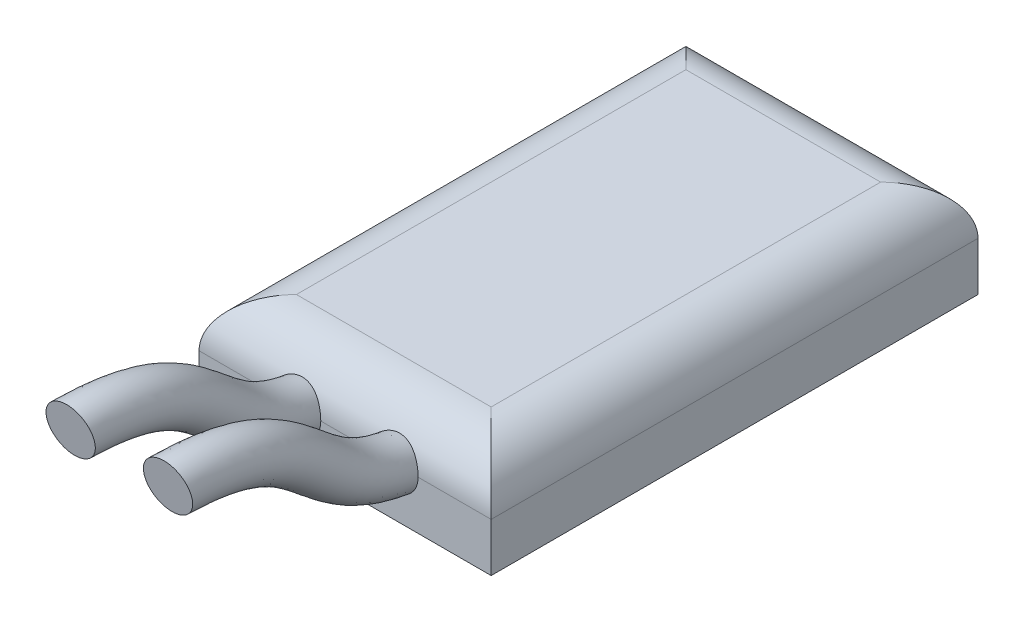
ISO-10303-21;
HEADER;
FILE_DESCRIPTION(('STEP AP214'),'2;1');
FILE_NAME('part.step','',(''),(''),'','','');
FILE_SCHEMA(('AUTOMOTIVE_DESIGN { 1 0 10303 214 1 1 1 1 }'));
ENDSEC;
DATA;
#1=APPLICATION_CONTEXT('core data for automotive mechanical design processes');
#2=APPLICATION_PROTOCOL_DEFINITION('international standard','automotive_design',2000,#1);
#3=PRODUCT_CONTEXT('',#1,'mechanical');
#4=PRODUCT('Part','Part','',(#3));
#5=PRODUCT_RELATED_PRODUCT_CATEGORY('part','',(#4));
#6=PRODUCT_DEFINITION_FORMATION('','',#4);
#7=PRODUCT_DEFINITION_CONTEXT('part definition',#1,'design');
#8=PRODUCT_DEFINITION('design','',#6,#7);
#9=PRODUCT_DEFINITION_SHAPE('','',#8);
#10=(LENGTH_UNIT() NAMED_UNIT(*) SI_UNIT(.MILLI.,.METRE.));
#11=(NAMED_UNIT(*) PLANE_ANGLE_UNIT() SI_UNIT($,.RADIAN.));
#12=(NAMED_UNIT(*) SI_UNIT($,.STERADIAN.) SOLID_ANGLE_UNIT());
#13=UNCERTAINTY_MEASURE_WITH_UNIT(LENGTH_MEASURE(1.E-05),#10,'distance_accuracy_value','');
#14=(GEOMETRIC_REPRESENTATION_CONTEXT(3) GLOBAL_UNCERTAINTY_ASSIGNED_CONTEXT((#13)) GLOBAL_UNIT_ASSIGNED_CONTEXT((#10,
#11,#12)) REPRESENTATION_CONTEXT('',''));
#15=CARTESIAN_POINT('',(0.,0.,0.));
#16=DIRECTION('',(0.,0.,1.));
#17=DIRECTION('',(1.,0.,0.));
#18=AXIS2_PLACEMENT_3D('',#15,#16,#17);
#19=CARTESIAN_POINT('',(0.,0.,5.));
#20=DIRECTION('',(1.,0.,0.));
#21=DIRECTION('',(0.,0.,-1.));
#22=AXIS2_PLACEMENT_3D('',#19,#20,#21);
#23=PLANE('',#22);
#24=DIRECTION('',(0.,-1.,0.));
#25=VECTOR('',#24,1.);
#26=CARTESIAN_POINT('',(0.,0.,5.));
#27=LINE('',#26,#25);
#28=CARTESIAN_POINT('',(0.,0.5,5.));
#29=VERTEX_POINT('',#28);
#30=CARTESIAN_POINT('',(0.,0.,5.));
#31=VERTEX_POINT('',#30);
#32=EDGE_CURVE('E97',#29,#31,#27,.T.);
#33=ORIENTED_EDGE('',*,*,#32,.F.);
#34=DIRECTION('',(0.,0.,-1.));
#35=VECTOR('',#34,1.);
#36=CARTESIAN_POINT('',(0.,0.5,5.));
#37=LINE('',#36,#35);
#38=CARTESIAN_POINT('',(0.,0.5,0.));
#39=VERTEX_POINT('',#38);
#40=EDGE_CURVE('E50',#29,#39,#37,.T.);
#41=ORIENTED_EDGE('',*,*,#40,.T.);
#42=DIRECTION('',(0.,-1.,0.));
#43=VECTOR('',#42,1.);
#44=CARTESIAN_POINT('',(0.,0.,0.));
#45=LINE('',#44,#43);
#46=CARTESIAN_POINT('',(0.,0.,0.));
#47=VERTEX_POINT('',#46);
#48=EDGE_CURVE('E115',#39,#47,#45,.T.);
#49=ORIENTED_EDGE('',*,*,#48,.T.);
#50=DIRECTION('',(0.,0.,-1.));
#51=VECTOR('',#50,1.);
#52=CARTESIAN_POINT('',(0.,0.,5.));
#53=LINE('',#52,#51);
#54=EDGE_CURVE('E109',#31,#47,#53,.T.);
#55=ORIENTED_EDGE('',*,*,#54,.F.);
#56=EDGE_LOOP('',(#33,#41,#49,#55));
#57=FACE_BOUND('',#56,.T.);
#58=ADVANCED_FACE('F33',(#57),#23,.F.);
#59=CARTESIAN_POINT('',(0.,0.,5.));
#60=DIRECTION('',(0.,1.,0.));
#61=DIRECTION('',(0.,0.,1.));
#62=AXIS2_PLACEMENT_3D('',#59,#60,#61);
#63=PLANE('',#62);
#64=DIRECTION('',(1.,0.,0.));
#65=VECTOR('',#64,1.);
#66=CARTESIAN_POINT('',(0.,0.,0.));
#67=LINE('',#66,#65);
#68=CARTESIAN_POINT('',(3.,0.,0.));
#69=VERTEX_POINT('',#68);
#70=EDGE_CURVE('E238',#47,#69,#67,.T.);
#71=ORIENTED_EDGE('',*,*,#70,.T.);
#72=DIRECTION('',(0.,0.,-1.));
#73=VECTOR('',#72,1.);
#74=CARTESIAN_POINT('',(3.,0.,5.));
#75=LINE('',#74,#73);
#76=CARTESIAN_POINT('',(3.,0.,5.));
#77=VERTEX_POINT('',#76);
#78=EDGE_CURVE('E111',#77,#69,#75,.T.);
#79=ORIENTED_EDGE('',*,*,#78,.F.);
#80=DIRECTION('',(1.,0.,0.));
#81=VECTOR('',#80,1.);
#82=CARTESIAN_POINT('',(0.,0.,5.));
#83=LINE('',#82,#81);
#84=EDGE_CURVE('E101',#31,#77,#83,.T.);
#85=ORIENTED_EDGE('',*,*,#84,.F.);
#86=ORIENTED_EDGE('',*,*,#54,.T.);
#87=EDGE_LOOP('',(#71,#79,#85,#86));
#88=FACE_BOUND('',#87,.T.);
#89=ADVANCED_FACE('F108',(#88),#63,.F.);
#90=CARTESIAN_POINT('',(3.,0.,5.));
#91=DIRECTION('',(-1.,0.,0.));
#92=DIRECTION('',(0.,0.,1.));
#93=AXIS2_PLACEMENT_3D('',#90,#91,#92);
#94=PLANE('',#93);
#95=DIRECTION('',(0.,1.,0.));
#96=VECTOR('',#95,1.);
#97=CARTESIAN_POINT('',(3.,0.,0.));
#98=LINE('',#97,#96);
#99=CARTESIAN_POINT('',(3.,0.5,0.));
#100=VERTEX_POINT('',#99);
#101=EDGE_CURVE('E104',#69,#100,#98,.T.);
#102=ORIENTED_EDGE('',*,*,#101,.T.);
#103=DIRECTION('',(0.,0.,-1.));
#104=VECTOR('',#103,1.);
#105=CARTESIAN_POINT('',(3.,0.5,5.));
#106=LINE('',#105,#104);
#107=CARTESIAN_POINT('',(3.,0.5,5.));
#108=VERTEX_POINT('',#107);
#109=EDGE_CURVE('E130',#100,#108,#106,.F.);
#110=ORIENTED_EDGE('',*,*,#109,.T.);
#111=DIRECTION('',(0.,1.,0.));
#112=VECTOR('',#111,1.);
#113=CARTESIAN_POINT('',(3.,0.,5.));
#114=LINE('',#113,#112);
#115=EDGE_CURVE('E113',#77,#108,#114,.T.);
#116=ORIENTED_EDGE('',*,*,#115,.F.);
#117=ORIENTED_EDGE('',*,*,#78,.T.);
#118=EDGE_LOOP('',(#102,#110,#116,#117));
#119=FACE_BOUND('',#118,.T.);
#120=ADVANCED_FACE('F195',(#119),#94,.F.);
#121=CARTESIAN_POINT('',(0.,1.,5.));
#122=DIRECTION('',(0.,-1.,0.));
#123=DIRECTION('',(0.,0.,-1.));
#124=AXIS2_PLACEMENT_3D('',#121,#122,#123);
#125=PLANE('',#124);
#126=DIRECTION('',(-1.,0.,0.));
#127=VECTOR('',#126,1.);
#128=CARTESIAN_POINT('',(0.,1.,4.5));
#129=LINE('',#128,#127);
#130=CARTESIAN_POINT('',(0.5,1.,4.5));
#131=VERTEX_POINT('',#130);
#132=CARTESIAN_POINT('',(2.5,1.,4.5));
#133=VERTEX_POINT('',#132);
#134=EDGE_CURVE('E125',#131,#133,#129,.F.);
#135=ORIENTED_EDGE('',*,*,#134,.T.);
#136=DIRECTION('',(0.,0.,-1.));
#137=VECTOR('',#136,1.);
#138=CARTESIAN_POINT('',(2.5,1.,5.));
#139=LINE('',#138,#137);
#140=CARTESIAN_POINT('',(2.5,1.,0.5));
#141=VERTEX_POINT('',#140);
#142=EDGE_CURVE('E127',#133,#141,#139,.T.);
#143=ORIENTED_EDGE('',*,*,#142,.T.);
#144=DIRECTION('',(-1.,0.,0.));
#145=VECTOR('',#144,1.);
#146=CARTESIAN_POINT('',(0.,1.,0.5));
#147=LINE('',#146,#145);
#148=CARTESIAN_POINT('',(0.5,1.,0.5));
#149=VERTEX_POINT('',#148);
#150=EDGE_CURVE('E117',#141,#149,#147,.T.);
#151=ORIENTED_EDGE('',*,*,#150,.T.);
#152=DIRECTION('',(0.,0.,-1.));
#153=VECTOR('',#152,1.);
#154=CARTESIAN_POINT('',(0.5,1.,5.));
#155=LINE('',#154,#153);
#156=EDGE_CURVE('E119',#149,#131,#155,.F.);
#157=ORIENTED_EDGE('',*,*,#156,.T.);
#158=EDGE_LOOP('',(#135,#143,#151,#157));
#159=FACE_BOUND('',#158,.T.);
#160=ADVANCED_FACE('F189',(#159),#125,.F.);
#161=CARTESIAN_POINT('',(0.,0.,5.));
#162=DIRECTION('',(0.,0.,-1.));
#163=DIRECTION('',(-1.,0.,0.));
#164=AXIS2_PLACEMENT_3D('',#161,#162,#163);
#165=PLANE('',#164);
#166=ORIENTED_EDGE('',*,*,#115,.T.);
#167=DIRECTION('',(-1.,0.,0.));
#168=VECTOR('',#167,1.);
#169=CARTESIAN_POINT('',(0.,0.5,5.));
#170=LINE('',#169,#168);
#171=CARTESIAN_POINT('',(2.25,0.5,5.));
#172=VERTEX_POINT('',#171);
#173=EDGE_CURVE('E136',#108,#172,#170,.T.);
#174=ORIENTED_EDGE('',*,*,#173,.T.);
#175=CARTESIAN_POINT('',(2.,0.5,5.));
#176=DIRECTION('',(0.,0.,1.));
#177=DIRECTION('',(1.,0.,0.));
#178=AXIS2_PLACEMENT_3D('',#175,#176,#177);
#179=CIRCLE('',#178,0.25);
#180=CARTESIAN_POINT('',(1.75,0.5,5.));
#181=VERTEX_POINT('',#180);
#182=EDGE_CURVE('E224',#181,#172,#179,.T.);
#183=ORIENTED_EDGE('',*,*,#182,.F.);
#184=DIRECTION('',(-1.,0.,0.));
#185=VECTOR('',#184,1.);
#186=CARTESIAN_POINT('',(0.,0.5,5.));
#187=LINE('',#186,#185);
#188=CARTESIAN_POINT('',(1.25,0.5,5.));
#189=VERTEX_POINT('',#188);
#190=EDGE_CURVE('E134',#181,#189,#187,.T.);
#191=ORIENTED_EDGE('',*,*,#190,.T.);
#192=CARTESIAN_POINT('',(1.,0.5,5.));
#193=DIRECTION('',(0.,0.,1.));
#194=DIRECTION('',(1.,0.,0.));
#195=AXIS2_PLACEMENT_3D('',#192,#193,#194);
#196=CIRCLE('',#195,0.25);
#197=CARTESIAN_POINT('',(0.75,0.5,5.));
#198=VERTEX_POINT('',#197);
#199=EDGE_CURVE('E241',#198,#189,#196,.T.);
#200=ORIENTED_EDGE('',*,*,#199,.F.);
#201=DIRECTION('',(-1.,0.,0.));
#202=VECTOR('',#201,1.);
#203=CARTESIAN_POINT('',(0.,0.5,5.));
#204=LINE('',#203,#202);
#205=EDGE_CURVE('E58',#198,#29,#204,.T.);
#206=ORIENTED_EDGE('',*,*,#205,.T.);
#207=ORIENTED_EDGE('',*,*,#32,.T.);
#208=ORIENTED_EDGE('',*,*,#84,.T.);
#209=EDGE_LOOP('',(#166,#174,#183,#191,#200,#206,#207,#208));
#210=FACE_BOUND('',#209,.T.);
#211=ADVANCED_FACE('F100',(#210),#165,.F.);
#212=CARTESIAN_POINT('',(0.,0.,0.));
#213=DIRECTION('',(0.,0.,-1.));
#214=DIRECTION('',(-1.,0.,0.));
#215=AXIS2_PLACEMENT_3D('',#212,#213,#214);
#216=PLANE('',#215);
#217=ORIENTED_EDGE('',*,*,#48,.F.);
#218=DIRECTION('',(-1.,0.,0.));
#219=VECTOR('',#218,1.);
#220=CARTESIAN_POINT('',(3.,0.5,0.));
#221=LINE('',#220,#219);
#222=EDGE_CURVE('E139',#39,#100,#221,.F.);
#223=ORIENTED_EDGE('',*,*,#222,.T.);
#224=ORIENTED_EDGE('',*,*,#101,.F.);
#225=ORIENTED_EDGE('',*,*,#70,.F.);
#226=EDGE_LOOP('',(#217,#223,#224,#225));
#227=FACE_BOUND('',#226,.T.);
#228=ADVANCED_FACE('F178',(#227),#216,.T.);
#229=CARTESIAN_POINT('',(1.,1.45475411675825,7.31871146241119));
#230=DIRECTION('',(0.,-0.164550430209248,0.986368671399265));
#231=DIRECTION('',(1.,0.,0.));
#232=AXIS2_PLACEMENT_3D('',#229,#230,#231);
#233=PLANE('',#232);
#234=CARTESIAN_POINT('',(1.,1.45475411675825,7.31871146241119));
#235=DIRECTION('',(0.,-0.164550430209248,0.986368671399265));
#236=DIRECTION('',(1.,0.,0.));
#237=AXIS2_PLACEMENT_3D('',#234,#235,#236);
#238=CIRCLE('',#237,0.25);
#239=CARTESIAN_POINT('',(1.25,1.45475411675825,7.31871146241119));
#240=VERTEX_POINT('',#239);
#241=EDGE_CURVE('E239',#240,#240,#238,.T.);
#242=ORIENTED_EDGE('',*,*,#241,.T.);
#243=EDGE_LOOP('',(#242));
#244=FACE_BOUND('',#243,.T.);
#245=ADVANCED_FACE('F163',(#244),#233,.T.);
#246=CARTESIAN_POINT('',(1.25,0.484125174758523,4.91276463227716));
#247=CARTESIAN_POINT('',(1.25,0.489416783172348,4.94184308818477));
#248=CARTESIAN_POINT('',(1.25,0.494708391586174,4.97092154409239));
#249=CARTESIAN_POINT('',(1.25,0.5,5.));
#250=CARTESIAN_POINT('',(1.25,0.544324867641731,5.24357409100102));
#251=CARTESIAN_POINT('',(1.25,0.624832357919834,5.42004031458958));
#252=CARTESIAN_POINT('',(1.25,0.817152865986225,5.72053832479848));
#253=CARTESIAN_POINT('',(1.25,0.928965979331224,5.84456992130128));
#254=CARTESIAN_POINT('',(1.25,1.14283791089854,6.12198018721746));
#255=CARTESIAN_POINT('',(1.25,1.2448968674697,6.27535858085717));
#256=CARTESIAN_POINT('',(1.25,1.39820080077118,6.69324367563508));
#257=CARTESIAN_POINT('',(1.25,1.44944585215809,6.9577502283356));
#258=CARTESIAN_POINT('',(1.25,1.45475411675825,7.31871146241119));
#259=CARTESIAN_POINT('',(1.25,0.984125168621809,4.935723922914));
#260=CARTESIAN_POINT('',(1.25,0.989416779081206,4.95714928194267));
#261=CARTESIAN_POINT('',(1.25,0.994708389540603,4.97857464097133));
#262=CARTESIAN_POINT('',(1.25,1.,5.));
#263=CARTESIAN_POINT('',(1.25,1.04432488477634,5.17946834475525));
#264=CARTESIAN_POINT('',(1.25,1.10679147464032,5.2774891327332));
#265=CARTESIAN_POINT('',(1.25,1.2603646857412,5.48353880081818));
#266=CARTESIAN_POINT('',(1.25,1.36200744077146,5.59343133675019));
#267=CARTESIAN_POINT('',(1.25,1.59827658361381,5.91420369115885));
#268=CARTESIAN_POINT('',(1.25,1.72655789329307,6.12653559257453));
#269=CARTESIAN_POINT('',(1.25,1.90185167484027,6.67130232358191));
#270=CARTESIAN_POINT('',(1.25,1.9498245403609,6.99690019670553));
#271=CARTESIAN_POINT('',(1.25,1.94793845245788,7.40098667751581));
#272=CARTESIAN_POINT('',(0.75,0.984125168621809,4.935723922914));
#273=CARTESIAN_POINT('',(0.75,0.989416779081206,4.95714928194267));
#274=CARTESIAN_POINT('',(0.75,0.994708389540603,4.97857464097133));
#275=CARTESIAN_POINT('',(0.75,1.,5.));
#276=CARTESIAN_POINT('',(0.75,1.04432488477634,5.17946834475525));
#277=CARTESIAN_POINT('',(0.75,1.10679147464032,5.2774891327332));
#278=CARTESIAN_POINT('',(0.75,1.2603646857412,5.48353880081818));
#279=CARTESIAN_POINT('',(0.75,1.36200744077146,5.59343133675019));
#280=CARTESIAN_POINT('',(0.75,1.59827658361381,5.91420369115885));
#281=CARTESIAN_POINT('',(0.75,1.72655789329307,6.12653559257453));
#282=CARTESIAN_POINT('',(0.75,1.90185167484027,6.67130232358191));
#283=CARTESIAN_POINT('',(0.75,1.9498245403609,6.99690019670553));
#284=CARTESIAN_POINT('',(0.75,1.94793845245788,7.40098667751581));
#285=CARTESIAN_POINT('',(0.75,0.484125174758523,4.91276463227716));
#286=CARTESIAN_POINT('',(0.75,0.489416783172348,4.94184308818477));
#287=CARTESIAN_POINT('',(0.75,0.494708391586174,4.97092154409239));
#288=CARTESIAN_POINT('',(0.75,0.5,5.));
#289=CARTESIAN_POINT('',(0.75,0.544324867641731,5.24357409100102));
#290=CARTESIAN_POINT('',(0.75,0.624832357919834,5.42004031458958));
#291=CARTESIAN_POINT('',(0.75,0.817152865986225,5.72053832479848));
#292=CARTESIAN_POINT('',(0.75,0.928965979331224,5.84456992130128));
#293=CARTESIAN_POINT('',(0.75,1.14283791089854,6.12198018721746));
#294=CARTESIAN_POINT('',(0.75,1.2448968674697,6.27535858085717));
#295=CARTESIAN_POINT('',(0.75,1.39820080077118,6.69324367563508));
#296=CARTESIAN_POINT('',(0.75,1.44944585215809,6.9577502283356));
#297=CARTESIAN_POINT('',(0.75,1.45475411675825,7.31871146241119));
#298=CARTESIAN_POINT('',(0.75,-0.0158748191047642,4.88980534164031));
#299=CARTESIAN_POINT('',(0.75,-0.0105832127365094,4.92653689442688));
#300=CARTESIAN_POINT('',(0.75,-0.00529160636825458,4.96326844721344));
#301=CARTESIAN_POINT('',(0.75,0.,5.));
#302=CARTESIAN_POINT('',(0.75,0.0443248505071182,5.30767983724679));
#303=CARTESIAN_POINT('',(0.75,0.142873241199346,5.56259149644595));
#304=CARTESIAN_POINT('',(0.75,0.373941046231253,5.95753784877878));
#305=CARTESIAN_POINT('',(0.75,0.495924517890983,6.09570850585235));
#306=CARTESIAN_POINT('',(0.75,0.687399238183271,6.32975668327608));
#307=CARTESIAN_POINT('',(0.75,0.763235841646333,6.42418156913982));
#308=CARTESIAN_POINT('',(0.75,0.894549926702098,6.71518502768825));
#309=CARTESIAN_POINT('',(0.75,0.949067163955284,6.91860025996567));
#310=CARTESIAN_POINT('',(0.75,0.96156978105862,7.23643624730656));
#311=CARTESIAN_POINT('',(1.25,-0.0158748191047642,4.88980534164031));
#312=CARTESIAN_POINT('',(1.25,-0.0105832127365094,4.92653689442688));
#313=CARTESIAN_POINT('',(1.25,-0.00529160636825458,4.96326844721344));
#314=CARTESIAN_POINT('',(1.25,0.,5.));
#315=CARTESIAN_POINT('',(1.25,0.0443248505071182,5.30767983724679));
#316=CARTESIAN_POINT('',(1.25,0.142873241199346,5.56259149644595));
#317=CARTESIAN_POINT('',(1.25,0.373941046231253,5.95753784877878));
#318=CARTESIAN_POINT('',(1.25,0.495924517890983,6.09570850585235));
#319=CARTESIAN_POINT('',(1.25,0.687399238183271,6.32975668327608));
#320=CARTESIAN_POINT('',(1.25,0.763235841646333,6.42418156913982));
#321=CARTESIAN_POINT('',(1.25,0.894549926702098,6.71518502768825));
#322=CARTESIAN_POINT('',(1.25,0.949067163955284,6.91860025996567));
#323=CARTESIAN_POINT('',(1.25,0.96156978105862,7.23643624730656));
#324=CARTESIAN_POINT('',(1.25,0.484125174758523,4.91276463227716));
#325=CARTESIAN_POINT('',(1.25,0.489416783172348,4.94184308818477));
#326=CARTESIAN_POINT('',(1.25,0.494708391586174,4.97092154409239));
#327=CARTESIAN_POINT('',(1.25,0.5,5.));
#328=CARTESIAN_POINT('',(1.25,0.544324867641731,5.24357409100102));
#329=CARTESIAN_POINT('',(1.25,0.624832357919834,5.42004031458958));
#330=CARTESIAN_POINT('',(1.25,0.817152865986225,5.72053832479848));
#331=CARTESIAN_POINT('',(1.25,0.928965979331224,5.84456992130128));
#332=CARTESIAN_POINT('',(1.25,1.14283791089854,6.12198018721746));
#333=CARTESIAN_POINT('',(1.25,1.2448968674697,6.27535858085717));
#334=CARTESIAN_POINT('',(1.25,1.39820080077118,6.69324367563508));
#335=CARTESIAN_POINT('',(1.25,1.44944585215809,6.9577502283356));
#336=CARTESIAN_POINT('',(1.25,1.45475411675825,7.31871146241119));
#337=(BOUNDED_SURFACE() B_SPLINE_SURFACE(3,3,((#246,#247,#248,#249,#250,#251,#252,#253,#254,
#255,#256,#257,#258),(#259,#260,#261,#262,#263,#264,#265,#266,#267,#268,#269,#270,#271),(#272,
#273,#274,#275,#276,#277,#278,#279,#280,#281,#282,#283,#284),(#285,#286,#287,#288,#289,#290,
#291,#292,#293,#294,#295,#296,#297),(#298,#299,#300,#301,#302,#303,#304,#305,#306,#307,#308,
#309,#310),(#311,#312,#313,#314,#315,#316,#317,#318,#319,#320,#321,#322,#323),(#324,#325,#326,
#327,#328,#329,#330,#331,#332,#333,#334,#335,#336)),.UNSPECIFIED.,.T.,.F.,
.F.) B_SPLINE_SURFACE_WITH_KNOTS((4,3,4),(4,3,2,2,2,4),(0.,0.5,1.),(-0.0298455962496988,0.,0.25,
0.5,0.75,1.),.UNSPECIFIED.) GEOMETRIC_REPRESENTATION_ITEM() RATIONAL_B_SPLINE_SURFACE(((1.,1.,
1.,1.,1.,1.,1.,1.,1.,1.,1.,1.,1.),(0.333333333333333,0.333333333333333,0.333333333333333,
0.333333333333333,0.333333333333333,0.333333333333333,0.333333333333333,0.333333333333333,
0.333333333333333,0.333333333333333,0.333333333333333,0.333333333333333,0.333333333333333),
(0.333333333333333,0.333333333333333,0.333333333333333,0.333333333333333,0.333333333333333,
0.333333333333333,0.333333333333333,0.333333333333333,0.333333333333333,0.333333333333333,
0.333333333333333,0.333333333333333,0.333333333333333),(1.,1.,1.,1.,1.,1.,1.,1.,1.,1.,1.,1.,1.),
(0.333333333333333,0.333333333333333,0.333333333333333,0.333333333333333,0.333333333333333,
0.333333333333333,0.333333333333333,0.333333333333333,0.333333333333333,0.333333333333333,
0.333333333333333,0.333333333333333,0.333333333333333),(0.333333333333333,0.333333333333333,
0.333333333333333,0.333333333333333,0.333333333333333,0.333333333333333,0.333333333333333,
0.333333333333333,0.333333333333333,0.333333333333333,0.333333333333333,0.333333333333333,
0.333333333333333),(1.,1.,1.,1.,1.,1.,1.,1.,1.,1.,1.,1.,1.))) REPRESENTATION_ITEM('') SURFACE());
#338=CARTESIAN_POINT('',(1.25,0.5,5.));
#339=CARTESIAN_POINT('',(1.25001577630331,0.512513802455175,5.00001619365283));
#340=CARTESIAN_POINT('',(1.24906134716007,0.525024510689209,4.99953076061347));
#341=CARTESIAN_POINT('',(1.24525245425931,0.549649437979137,4.99767725604978));
#342=CARTESIAN_POINT('',(1.24240348425047,0.561764697492437,4.99631173693172));
#343=CARTESIAN_POINT('',(1.23484355214938,0.585291017112419,4.99281647419435));
#344=CARTESIAN_POINT('',(1.2301316018971,0.596701699778477,4.9906863250561));
#345=CARTESIAN_POINT('',(1.21899265086083,0.618516055103149,4.98587976062008));
#346=CARTESIAN_POINT('',(1.21256518625015,0.628919454382556,4.98320319763352));
#347=CARTESIAN_POINT('',(1.19067462552337,0.658672120474904,4.97460662912489));
#348=CARTESIAN_POINT('',(1.17274823478544,0.676126184410754,4.96819864933513));
#349=CARTESIAN_POINT('',(1.13065578805668,0.705889026988834,4.95595895019218));
#350=CARTESIAN_POINT('',(1.10611923128226,0.717706328405786,4.95020796376071));
#351=CARTESIAN_POINT('',(1.06675675880159,0.729700653902038,4.944135285532));
#352=CARTESIAN_POINT('',(1.05293092191441,0.732742470860885,4.94253261415151));
#353=CARTESIAN_POINT('',(1.02488233049136,0.736686759639859,4.94043748632099));
#354=CARTESIAN_POINT('',(1.01065962253997,0.737589481485852,4.93994490012017));
#355=CARTESIAN_POINT('',(0.98250050746977,0.737234701181964,4.94013578012992));
#356=CARTESIAN_POINT('',(0.968563418383754,0.736014448187997,4.94079896778553));
#357=CARTESIAN_POINT('',(0.941101977934181,0.73150612262758,4.94318322586574));
#358=CARTESIAN_POINT('',(0.927578207566431,0.728215268066099,4.94490571946999));
#359=CARTESIAN_POINT('',(0.901336861774428,0.719616945024645,4.94921189526239));
#360=CARTESIAN_POINT('',(0.888619165251762,0.714309780301696,4.95179544772487));
#361=CARTESIAN_POINT('',(0.864321425112865,0.701756843467227,4.95753868589132));
#362=CARTESIAN_POINT('',(0.852741389763131,0.69451105727068,4.96069837578116));
#363=CARTESIAN_POINT('',(0.830831329560909,0.678038112455434,4.96731408929893));
#364=CARTESIAN_POINT('',(0.820527610322683,0.668777581572601,4.97077442904957));
#365=CARTESIAN_POINT('',(0.801751491258326,0.648538312255451,4.97754546770545));
#366=CARTESIAN_POINT('',(0.793275427009547,0.637563089451016,4.9808564553114));
#367=CARTESIAN_POINT('',(0.778709019055091,0.614590315240592,4.98683093453614));
#368=CARTESIAN_POINT('',(0.772539421861002,0.602648355844245,4.98951443953976));
#369=CARTESIAN_POINT('',(0.762358908107379,0.577737292166054,4.99408152467847));
#370=CARTESIAN_POINT('',(0.758345930328228,0.564769182294179,4.99596586825887));
#371=CARTESIAN_POINT('',(0.753641060044594,0.543082071534407,4.99821285406736));
#372=CARTESIAN_POINT('',(0.752272014396903,0.534534378857633,4.99887972070089));
#373=CARTESIAN_POINT('',(0.750450666228952,0.517325570863692,4.99977464631043));
#374=CARTESIAN_POINT('',(0.749997677584225,0.50866454533011,5.00000303369982));
#375=CARTESIAN_POINT('',(0.75,0.5,5.));
#376=B_SPLINE_CURVE_WITH_KNOTS('',3,(#338,#339,#340,#341,#342,#343,#344,#345,#346,#347,#348,
#349,#350,#351,#352,#353,#354,#355,#356,#357,#358,#359,#360,#361,#362,#363,#364,#365,#366,#367,
#368,#369,#370,#371,#372,#373,#374,#375),.UNSPECIFIED.,.F.,.F.,(4,2,2,2,2,2,2,2,2,2,2,2,2,2,2,2,
2,2,4),(0.,0.037489072782986,0.0748699068652264,0.11227059510757,0.149681405702197,
0.225841492207322,0.30778604220665,0.350350118574107,0.392909219639123,0.434729100474368,
0.476605289517957,0.518475172415747,0.560345359526842,0.60297055340373,0.645509472884812,
0.686411456499948,0.727274277623486,0.753264911663422,0.779236071560857),.UNSPECIFIED.);
#377=EDGE_CURVE('E11',#189,#198,#376,.T.);
#378=ORIENTED_EDGE('',*,*,#241,.F.);
#379=EDGE_LOOP('',(#378));
#380=FACE_BOUND('',#379,.T.);
#381=ORIENTED_EDGE('',*,*,#199,.T.);
#382=ORIENTED_EDGE('',*,*,#377,.T.);
#383=EDGE_LOOP('',(#381,#382));
#384=FACE_BOUND('',#383,.T.);
#385=ADVANCED_FACE('F170',(#380,#384),#337,.T.);
#386=CARTESIAN_POINT('',(2.,1.45475411675825,7.31871146241119));
#387=DIRECTION('',(0.,-0.164550430209248,0.986368671399265));
#388=DIRECTION('',(1.,0.,0.));
#389=AXIS2_PLACEMENT_3D('',#386,#387,#388);
#390=PLANE('',#389);
#391=CARTESIAN_POINT('',(2.,1.45475411675825,7.31871146241119));
#392=DIRECTION('',(0.,-0.164550430209248,0.986368671399265));
#393=DIRECTION('',(1.,0.,0.));
#394=AXIS2_PLACEMENT_3D('',#391,#392,#393);
#395=CIRCLE('',#394,0.25);
#396=CARTESIAN_POINT('',(2.25,1.45475411675825,7.31871146241119));
#397=VERTEX_POINT('',#396);
#398=EDGE_CURVE('E245',#397,#397,#395,.T.);
#399=ORIENTED_EDGE('',*,*,#398,.T.);
#400=EDGE_LOOP('',(#399));
#401=FACE_BOUND('',#400,.T.);
#402=ADVANCED_FACE('F161',(#401),#390,.T.);
#403=CARTESIAN_POINT('',(2.25,0.484125174758529,4.91276463227719));
#404=CARTESIAN_POINT('',(2.25,0.489416783172353,4.9418430881848));
#405=CARTESIAN_POINT('',(2.25,0.494708391586176,4.9709215440924));
#406=CARTESIAN_POINT('',(2.25,0.5,5.));
#407=CARTESIAN_POINT('',(2.25,0.544324867641731,5.24357409100102));
#408=CARTESIAN_POINT('',(2.25,0.624832357919834,5.42004031458958));
#409=CARTESIAN_POINT('',(2.25,0.817152865986225,5.72053832479848));
#410=CARTESIAN_POINT('',(2.25,0.928965979331224,5.84456992130128));
#411=CARTESIAN_POINT('',(2.25,1.14283791089854,6.12198018721746));
#412=CARTESIAN_POINT('',(2.25,1.2448968674697,6.27535858085717));
#413=CARTESIAN_POINT('',(2.25,1.39820080077118,6.69324367563508));
#414=CARTESIAN_POINT('',(2.25,1.44944585215809,6.9577502283356));
#415=CARTESIAN_POINT('',(2.25,1.45475411675825,7.31871146241119));
#416=CARTESIAN_POINT('',(2.25,0.984125168621817,4.93572392291403));
#417=CARTESIAN_POINT('',(2.25,0.989416779081212,4.95714928194268));
#418=CARTESIAN_POINT('',(2.25,0.994708389540606,4.97857464097134));
#419=CARTESIAN_POINT('',(2.25,1.,5.));
#420=CARTESIAN_POINT('',(2.25,1.04432488477635,5.17946834475525));
#421=CARTESIAN_POINT('',(2.25,1.10679147464032,5.27748913273316));
#422=CARTESIAN_POINT('',(2.25,1.2603646857412,5.48353880081822));
#423=CARTESIAN_POINT('',(2.25,1.36200744077147,5.59343133675019));
#424=CARTESIAN_POINT('',(2.25,1.59827658361381,5.91420369115885));
#425=CARTESIAN_POINT('',(2.25,1.72655789329307,6.12653559257453));
#426=CARTESIAN_POINT('',(2.25,1.90185167484027,6.67130232358191));
#427=CARTESIAN_POINT('',(2.25,1.9498245403609,6.99690019670584));
#428=CARTESIAN_POINT('',(2.25,1.94793845245789,7.40098667751581));
#429=CARTESIAN_POINT('',(1.75,0.984125168621817,4.93572392291403));
#430=CARTESIAN_POINT('',(1.75,0.989416779081212,4.95714928194268));
#431=CARTESIAN_POINT('',(1.75,0.994708389540606,4.97857464097134));
#432=CARTESIAN_POINT('',(1.75,1.,5.));
#433=CARTESIAN_POINT('',(1.75,1.04432488477635,5.17946834475525));
#434=CARTESIAN_POINT('',(1.75,1.10679147464032,5.27748913273316));
#435=CARTESIAN_POINT('',(1.75,1.2603646857412,5.48353880081822));
#436=CARTESIAN_POINT('',(1.75,1.36200744077147,5.59343133675019));
#437=CARTESIAN_POINT('',(1.75,1.59827658361381,5.91420369115885));
#438=CARTESIAN_POINT('',(1.75,1.72655789329307,6.12653559257453));
#439=CARTESIAN_POINT('',(1.75,1.90185167484027,6.67130232358191));
#440=CARTESIAN_POINT('',(1.75,1.9498245403609,6.99690019670584));
#441=CARTESIAN_POINT('',(1.75,1.94793845245789,7.40098667751581));
#442=CARTESIAN_POINT('',(1.75,0.484125174758529,4.91276463227719));
#443=CARTESIAN_POINT('',(1.75,0.489416783172353,4.9418430881848));
#444=CARTESIAN_POINT('',(1.75,0.494708391586176,4.9709215440924));
#445=CARTESIAN_POINT('',(1.75,0.5,5.));
#446=CARTESIAN_POINT('',(1.75,0.544324867641731,5.24357409100102));
#447=CARTESIAN_POINT('',(1.75,0.624832357919834,5.42004031458958));
#448=CARTESIAN_POINT('',(1.75,0.817152865986225,5.72053832479848));
#449=CARTESIAN_POINT('',(1.75,0.928965979331224,5.84456992130128));
#450=CARTESIAN_POINT('',(1.75,1.14283791089854,6.12198018721746));
#451=CARTESIAN_POINT('',(1.75,1.2448968674697,6.27535858085717));
#452=CARTESIAN_POINT('',(1.75,1.39820080077118,6.69324367563508));
#453=CARTESIAN_POINT('',(1.75,1.44944585215809,6.9577502283356));
#454=CARTESIAN_POINT('',(1.75,1.45475411675825,7.31871146241119));
#455=CARTESIAN_POINT('',(1.75,-0.0158748191047583,4.88980534164036));
#456=CARTESIAN_POINT('',(1.75,-0.0105832127365057,4.92653689442691));
#457=CARTESIAN_POINT('',(1.75,-0.00529160636825318,4.96326844721345));
#458=CARTESIAN_POINT('',(1.75,0.,5.));
#459=CARTESIAN_POINT('',(1.75,0.0443248505071173,5.30767983724679));
#460=CARTESIAN_POINT('',(1.75,0.142873241199345,5.56259149644599));
#461=CARTESIAN_POINT('',(1.75,0.373941046231252,5.95753784877874));
#462=CARTESIAN_POINT('',(1.75,0.495924517890982,6.09570850585235));
#463=CARTESIAN_POINT('',(1.75,0.68739923818327,6.32975668327608));
#464=CARTESIAN_POINT('',(1.75,0.763235841646332,6.42418156913982));
#465=CARTESIAN_POINT('',(1.75,0.894549926702097,6.71518502768825));
#466=CARTESIAN_POINT('',(1.75,0.949067163955283,6.91860025996535));
#467=CARTESIAN_POINT('',(1.75,0.961569781058619,7.23643624730656));
#468=CARTESIAN_POINT('',(2.25,-0.0158748191047583,4.88980534164036));
#469=CARTESIAN_POINT('',(2.25,-0.0105832127365057,4.92653689442691));
#470=CARTESIAN_POINT('',(2.25,-0.00529160636825318,4.96326844721345));
#471=CARTESIAN_POINT('',(2.25,0.,5.));
#472=CARTESIAN_POINT('',(2.25,0.0443248505071173,5.30767983724679));
#473=CARTESIAN_POINT('',(2.25,0.142873241199345,5.56259149644599));
#474=CARTESIAN_POINT('',(2.25,0.373941046231252,5.95753784877874));
#475=CARTESIAN_POINT('',(2.25,0.495924517890982,6.09570850585235));
#476=CARTESIAN_POINT('',(2.25,0.68739923818327,6.32975668327608));
#477=CARTESIAN_POINT('',(2.25,0.763235841646332,6.42418156913982));
#478=CARTESIAN_POINT('',(2.25,0.894549926702097,6.71518502768825));
#479=CARTESIAN_POINT('',(2.25,0.949067163955283,6.91860025996535));
#480=CARTESIAN_POINT('',(2.25,0.961569781058619,7.23643624730656));
#481=CARTESIAN_POINT('',(2.25,0.484125174758529,4.91276463227719));
#482=CARTESIAN_POINT('',(2.25,0.489416783172353,4.9418430881848));
#483=CARTESIAN_POINT('',(2.25,0.494708391586176,4.9709215440924));
#484=CARTESIAN_POINT('',(2.25,0.5,5.));
#485=CARTESIAN_POINT('',(2.25,0.544324867641731,5.24357409100102));
#486=CARTESIAN_POINT('',(2.25,0.624832357919834,5.42004031458958));
#487=CARTESIAN_POINT('',(2.25,0.817152865986225,5.72053832479848));
#488=CARTESIAN_POINT('',(2.25,0.928965979331224,5.84456992130128));
#489=CARTESIAN_POINT('',(2.25,1.14283791089854,6.12198018721746));
#490=CARTESIAN_POINT('',(2.25,1.2448968674697,6.27535858085717));
#491=CARTESIAN_POINT('',(2.25,1.39820080077118,6.69324367563508));
#492=CARTESIAN_POINT('',(2.25,1.44944585215809,6.9577502283356));
#493=CARTESIAN_POINT('',(2.25,1.45475411675825,7.31871146241119));
#494=(BOUNDED_SURFACE() B_SPLINE_SURFACE(3,3,((#403,#404,#405,#406,#407,#408,#409,#410,#411,
#412,#413,#414,#415),(#416,#417,#418,#419,#420,#421,#422,#423,#424,#425,#426,#427,#428),(#429,
#430,#431,#432,#433,#434,#435,#436,#437,#438,#439,#440,#441),(#442,#443,#444,#445,#446,#447,
#448,#449,#450,#451,#452,#453,#454),(#455,#456,#457,#458,#459,#460,#461,#462,#463,#464,#465,
#466,#467),(#468,#469,#470,#471,#472,#473,#474,#475,#476,#477,#478,#479,#480),(#481,#482,#483,
#484,#485,#486,#487,#488,#489,#490,#491,#492,#493)),.UNSPECIFIED.,.T.,.F.,
.F.) B_SPLINE_SURFACE_WITH_KNOTS((4,3,4),(4,3,2,2,2,4),(0.,0.5,1.),(-0.029845596249686,0.,0.25,
0.5,0.75,1.),.UNSPECIFIED.) GEOMETRIC_REPRESENTATION_ITEM() RATIONAL_B_SPLINE_SURFACE(((1.,1.,
1.,1.,1.,1.,1.,1.,1.,1.,1.,1.,1.),(0.333333333333333,0.333333333333333,0.333333333333333,
0.333333333333333,0.333333333333333,0.333333333333333,0.333333333333333,0.333333333333333,
0.333333333333333,0.333333333333333,0.333333333333333,0.333333333333333,0.333333333333333),
(0.333333333333333,0.333333333333333,0.333333333333333,0.333333333333333,0.333333333333333,
0.333333333333333,0.333333333333333,0.333333333333333,0.333333333333333,0.333333333333333,
0.333333333333333,0.333333333333333,0.333333333333333),(1.,1.,1.,1.,1.,1.,1.,1.,1.,1.,1.,1.,1.),
(0.333333333333333,0.333333333333333,0.333333333333333,0.333333333333333,0.333333333333333,
0.333333333333333,0.333333333333333,0.333333333333333,0.333333333333333,0.333333333333333,
0.333333333333333,0.333333333333333,0.333333333333333),(0.333333333333333,0.333333333333333,
0.333333333333333,0.333333333333333,0.333333333333333,0.333333333333333,0.333333333333333,
0.333333333333333,0.333333333333333,0.333333333333333,0.333333333333333,0.333333333333333,
0.333333333333333),(1.,1.,1.,1.,1.,1.,1.,1.,1.,1.,1.,1.,1.))) REPRESENTATION_ITEM('') SURFACE());
#495=CARTESIAN_POINT('',(2.25,0.5,5.));
#496=CARTESIAN_POINT('',(2.25001577630331,0.512513802455175,5.00001619365283));
#497=CARTESIAN_POINT('',(2.24906134716007,0.525024510689209,4.99953076061347));
#498=CARTESIAN_POINT('',(2.24525245425931,0.549649437979137,4.99767725604978));
#499=CARTESIAN_POINT('',(2.24240348425047,0.561764697492437,4.99631173693172));
#500=CARTESIAN_POINT('',(2.23484355214938,0.58529101711242,4.99281647419435));
#501=CARTESIAN_POINT('',(2.2301316018971,0.596701699778478,4.9906863250561));
#502=CARTESIAN_POINT('',(2.21899265086083,0.61851605510315,4.98587976062008));
#503=CARTESIAN_POINT('',(2.21256518625015,0.628919454382557,4.98320319763352));
#504=CARTESIAN_POINT('',(2.19067462552337,0.658672120474905,4.97460662912489));
#505=CARTESIAN_POINT('',(2.17274823478544,0.676126184410755,4.96819864933513));
#506=CARTESIAN_POINT('',(2.13065578805668,0.705889026988835,4.95595895019218));
#507=CARTESIAN_POINT('',(2.10611923128226,0.717706328405785,4.9502079637607));
#508=CARTESIAN_POINT('',(2.06675675880159,0.729700653902037,4.944135285532));
#509=CARTESIAN_POINT('',(2.05293092191441,0.732742470860885,4.94253261415151));
#510=CARTESIAN_POINT('',(2.02488233049136,0.736686759639859,4.94043748632099));
#511=CARTESIAN_POINT('',(2.01065962253997,0.737589481485853,4.93994490012017));
#512=CARTESIAN_POINT('',(1.98250050746977,0.737234701181964,4.94013578012992));
#513=CARTESIAN_POINT('',(1.96856341838375,0.736014448187998,4.94079896778553));
#514=CARTESIAN_POINT('',(1.94110197793418,0.73150612262758,4.94318322586574));
#515=CARTESIAN_POINT('',(1.92757820756643,0.728215268066099,4.94490571946999));
#516=CARTESIAN_POINT('',(1.90133686177443,0.719616945024646,4.94921189526238));
#517=CARTESIAN_POINT('',(1.88861916525176,0.714309780301696,4.95179544772487));
#518=CARTESIAN_POINT('',(1.86432142511287,0.701756843467227,4.95753868589132));
#519=CARTESIAN_POINT('',(1.85274138976313,0.694511057270681,4.96069837578116));
#520=CARTESIAN_POINT('',(1.83083132956091,0.678038112455435,4.96731408929893));
#521=CARTESIAN_POINT('',(1.82052761032268,0.668777581572601,4.97077442904957));
#522=CARTESIAN_POINT('',(1.80175149125833,0.648538312255451,4.97754546770545));
#523=CARTESIAN_POINT('',(1.79327542700955,0.637563089451017,4.98085645531141));
#524=CARTESIAN_POINT('',(1.77870901905509,0.614590315240594,4.98683093453614));
#525=CARTESIAN_POINT('',(1.772539421861,0.602648355844247,4.98951443953976));
#526=CARTESIAN_POINT('',(1.76235890810738,0.577737292166055,4.99408152467847));
#527=CARTESIAN_POINT('',(1.75834593032823,0.564769182294181,4.99596586825887));
#528=CARTESIAN_POINT('',(1.75364106004459,0.543082071534408,4.99821285406736));
#529=CARTESIAN_POINT('',(1.7522720143969,0.534534378857634,4.99887972070089));
#530=CARTESIAN_POINT('',(1.75045066622895,0.517325570863693,4.99977464631043));
#531=CARTESIAN_POINT('',(1.74999767758423,0.50866454533011,5.00000303369983));
#532=CARTESIAN_POINT('',(1.75,0.5,5.));
#533=B_SPLINE_CURVE_WITH_KNOTS('',3,(#495,#496,#497,#498,#499,#500,#501,#502,#503,#504,#505,
#506,#507,#508,#509,#510,#511,#512,#513,#514,#515,#516,#517,#518,#519,#520,#521,#522,#523,#524,
#525,#526,#527,#528,#529,#530,#531,#532),.UNSPECIFIED.,.F.,.F.,(4,2,2,2,2,2,2,2,2,2,2,2,2,2,2,2,
2,2,4),(0.,0.0374890727829864,0.0748699068652271,0.11227059510757,0.149681405702198,
0.225841492207323,0.307786042206651,0.350350118574108,0.392909219639122,0.434729100474369,
0.476605289517958,0.518475172415748,0.560345359526843,0.60297055340373,0.645509472884812,
0.686411456499947,0.727274277623485,0.753264911663422,0.779236071560857),.UNSPECIFIED.);
#534=EDGE_CURVE('E42',#172,#181,#533,.T.);
#535=ORIENTED_EDGE('',*,*,#398,.F.);
#536=EDGE_LOOP('',(#535));
#537=FACE_BOUND('',#536,.T.);
#538=ORIENTED_EDGE('',*,*,#182,.T.);
#539=ORIENTED_EDGE('',*,*,#534,.T.);
#540=EDGE_LOOP('',(#538,#539));
#541=FACE_BOUND('',#540,.T.);
#542=ADVANCED_FACE('F155',(#537,#541),#494,.T.);
#543=CARTESIAN_POINT('',(0.5,0.5,5.));
#544=DIRECTION('',(0.,0.,-1.));
#545=DIRECTION('',(-1.,0.,0.));
#546=AXIS2_PLACEMENT_3D('',#543,#544,#545);
#547=CYLINDRICAL_SURFACE('',#546,0.5);
#548=CARTESIAN_POINT('',(0.5,0.5,0.5));
#549=DIRECTION('',(0.707106781186547,0.,-0.707106781186547));
#550=DIRECTION('',(0.707106781186547,0.,0.707106781186547));
#551=AXIS2_PLACEMENT_3D('',#548,#549,#550);
#552=ELLIPSE('',#551,0.707106781186547,0.5);
#553=EDGE_CURVE('E218',#39,#149,#552,.T.);
#554=ORIENTED_EDGE('',*,*,#553,.F.);
#555=ORIENTED_EDGE('',*,*,#40,.F.);
#556=CARTESIAN_POINT('',(0.5,0.5,4.5));
#557=DIRECTION('',(-0.707106781186547,0.,-0.707106781186547));
#558=DIRECTION('',(0.707106781186547,0.,-0.707106781186547));
#559=AXIS2_PLACEMENT_3D('',#556,#557,#558);
#560=ELLIPSE('',#559,0.707106781186547,0.5);
#561=EDGE_CURVE('E37',#131,#29,#560,.F.);
#562=ORIENTED_EDGE('',*,*,#561,.F.);
#563=ORIENTED_EDGE('',*,*,#156,.F.);
#564=EDGE_LOOP('',(#554,#555,#562,#563));
#565=FACE_BOUND('',#564,.T.);
#566=ADVANCED_FACE('F35',(#565),#547,.T.);
#567=CARTESIAN_POINT('',(0.,0.5,4.5));
#568=DIRECTION('',(-1.,0.,0.));
#569=DIRECTION('',(0.,0.,1.));
#570=AXIS2_PLACEMENT_3D('',#567,#568,#569);
#571=CYLINDRICAL_SURFACE('',#570,0.5);
#572=ORIENTED_EDGE('',*,*,#534,.F.);
#573=ORIENTED_EDGE('',*,*,#173,.F.);
#574=CARTESIAN_POINT('',(2.5,0.5,4.5));
#575=DIRECTION('',(-0.707106781186547,0.,0.707106781186547));
#576=DIRECTION('',(-0.707106781186547,0.,-0.707106781186547));
#577=AXIS2_PLACEMENT_3D('',#574,#575,#576);
#578=ELLIPSE('',#577,0.707106781186547,0.5);
#579=EDGE_CURVE('E222',#133,#108,#578,.F.);
#580=ORIENTED_EDGE('',*,*,#579,.F.);
#581=ORIENTED_EDGE('',*,*,#134,.F.);
#582=ORIENTED_EDGE('',*,*,#561,.T.);
#583=ORIENTED_EDGE('',*,*,#205,.F.);
#584=ORIENTED_EDGE('',*,*,#377,.F.);
#585=ORIENTED_EDGE('',*,*,#190,.F.);
#586=EDGE_LOOP('',(#572,#573,#580,#581,#582,#583,#584,#585));
#587=FACE_BOUND('',#586,.T.);
#588=ADVANCED_FACE('F152',(#587),#571,.T.);
#589=CARTESIAN_POINT('',(0.,0.5,0.5));
#590=DIRECTION('',(1.,0.,0.));
#591=DIRECTION('',(0.,0.,-1.));
#592=AXIS2_PLACEMENT_3D('',#589,#590,#591);
#593=CYLINDRICAL_SURFACE('',#592,0.5);
#594=ORIENTED_EDGE('',*,*,#553,.T.);
#595=ORIENTED_EDGE('',*,*,#150,.F.);
#596=CARTESIAN_POINT('',(2.5,0.5,0.5));
#597=DIRECTION('',(0.707106781186547,0.,0.707106781186547));
#598=DIRECTION('',(0.707106781186547,0.,-0.707106781186547));
#599=AXIS2_PLACEMENT_3D('',#596,#597,#598);
#600=ELLIPSE('',#599,0.707106781186547,0.5);
#601=EDGE_CURVE('E225',#100,#141,#600,.T.);
#602=ORIENTED_EDGE('',*,*,#601,.F.);
#603=ORIENTED_EDGE('',*,*,#222,.F.);
#604=EDGE_LOOP('',(#594,#595,#602,#603));
#605=FACE_BOUND('',#604,.T.);
#606=ADVANCED_FACE('F206',(#605),#593,.T.);
#607=CARTESIAN_POINT('',(2.5,0.5,5.));
#608=DIRECTION('',(0.,0.,-1.));
#609=DIRECTION('',(-1.,0.,0.));
#610=AXIS2_PLACEMENT_3D('',#607,#608,#609);
#611=CYLINDRICAL_SURFACE('',#610,0.5);
#612=ORIENTED_EDGE('',*,*,#579,.T.);
#613=ORIENTED_EDGE('',*,*,#109,.F.);
#614=ORIENTED_EDGE('',*,*,#601,.T.);
#615=ORIENTED_EDGE('',*,*,#142,.F.);
#616=EDGE_LOOP('',(#612,#613,#614,#615));
#617=FACE_BOUND('',#616,.T.);
#618=ADVANCED_FACE('F204',(#617),#611,.T.);
#619=CLOSED_SHELL('',(#58,#89,#120,#160,#211,#228,#245,#385,#402,#542,#566,#588,#606,#618));
#620=MANIFOLD_SOLID_BREP('B2',#619);
#621=ADVANCED_BREP_SHAPE_REPRESENTATION('',(#18,#620),#14);
#622=SHAPE_DEFINITION_REPRESENTATION(#9,#621);
ENDSEC;
END-ISO-10303-21;
